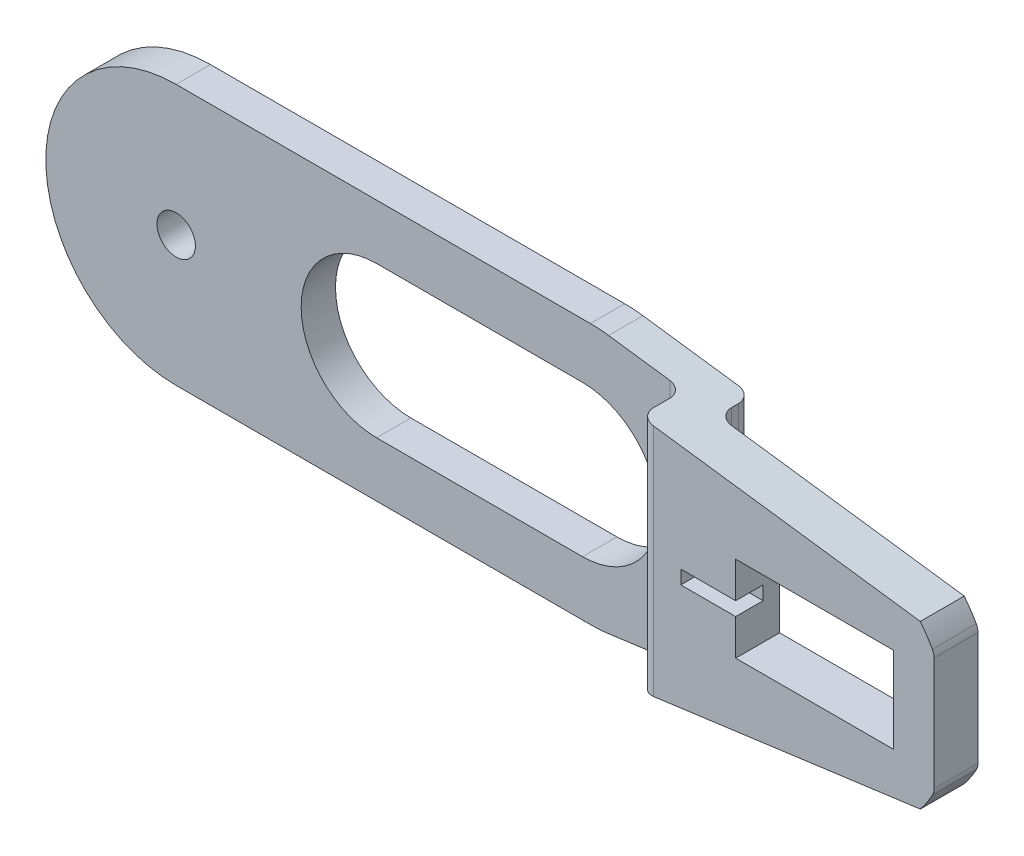
ISO-10303-21;
HEADER;
FILE_DESCRIPTION(('STEP AP214'),'2;1');
FILE_NAME('part.step','',(''),(''),'','','');
FILE_SCHEMA(('AUTOMOTIVE_DESIGN { 1 0 10303 214 1 1 1 1 }'));
ENDSEC;
DATA;
#1=APPLICATION_CONTEXT('core data for automotive mechanical design processes');
#2=APPLICATION_PROTOCOL_DEFINITION('international standard','automotive_design',2000,#1);
#3=PRODUCT_CONTEXT('',#1,'mechanical');
#4=PRODUCT('Part','Part','',(#3));
#5=PRODUCT_RELATED_PRODUCT_CATEGORY('part','',(#4));
#6=PRODUCT_DEFINITION_FORMATION('','',#4);
#7=PRODUCT_DEFINITION_CONTEXT('part definition',#1,'design');
#8=PRODUCT_DEFINITION('design','',#6,#7);
#9=PRODUCT_DEFINITION_SHAPE('','',#8);
#10=(LENGTH_UNIT() NAMED_UNIT(*) SI_UNIT(.MILLI.,.METRE.));
#11=(NAMED_UNIT(*) PLANE_ANGLE_UNIT() SI_UNIT($,.RADIAN.));
#12=(NAMED_UNIT(*) SI_UNIT($,.STERADIAN.) SOLID_ANGLE_UNIT());
#13=UNCERTAINTY_MEASURE_WITH_UNIT(LENGTH_MEASURE(1.E-05),#10,'distance_accuracy_value','');
#14=(GEOMETRIC_REPRESENTATION_CONTEXT(3) GLOBAL_UNCERTAINTY_ASSIGNED_CONTEXT((#13)) GLOBAL_UNIT_ASSIGNED_CONTEXT((#10,
#11,#12)) REPRESENTATION_CONTEXT('',''));
#15=CARTESIAN_POINT('',(0.,0.,0.));
#16=DIRECTION('',(0.,0.,1.));
#17=DIRECTION('',(1.,0.,0.));
#18=AXIS2_PLACEMENT_3D('',#15,#16,#17);
#19=CARTESIAN_POINT('',(114.863966496195,-8.25,5.));
#20=DIRECTION('',(0.,0.,-1.));
#21=DIRECTION('',(-1.,0.,0.));
#22=AXIS2_PLACEMENT_3D('',#19,#20,#21);
#23=CYLINDRICAL_SURFACE('',#22,2.);
#24=CARTESIAN_POINT('',(114.863966496195,-8.25,5.));
#25=DIRECTION('',(0.,0.,1.));
#26=DIRECTION('',(1.,0.,0.));
#27=AXIS2_PLACEMENT_3D('',#24,#25,#26);
#28=CIRCLE('',#27,2.);
#29=CARTESIAN_POINT('',(116.863966496195,-8.25,5.));
#30=VERTEX_POINT('',#29);
#31=CARTESIAN_POINT('',(116.612668436924,-9.22058823529413,5.));
#32=VERTEX_POINT('',#31);
#33=EDGE_CURVE('E285',#30,#32,#28,.F.);
#34=ORIENTED_EDGE('',*,*,#33,.F.);
#35=DIRECTION('',(0.,0.,1.));
#36=VECTOR('',#35,1.);
#37=CARTESIAN_POINT('',(116.863966496195,-8.25,-12.5303274767766));
#38=LINE('',#37,#36);
#39=CARTESIAN_POINT('',(116.863966496195,-8.25,11.4));
#40=VERTEX_POINT('',#39);
#41=EDGE_CURVE('E517',#30,#40,#38,.T.);
#42=ORIENTED_EDGE('',*,*,#41,.T.);
#43=CARTESIAN_POINT('',(114.863966496195,-8.25,11.4));
#44=DIRECTION('',(0.,0.,1.));
#45=DIRECTION('',(1.,0.,0.));
#46=AXIS2_PLACEMENT_3D('',#43,#44,#45);
#47=CIRCLE('',#46,2.);
#48=CARTESIAN_POINT('',(116.612668436924,-9.22058823529413,11.4));
#49=VERTEX_POINT('',#48);
#50=EDGE_CURVE('E405',#49,#40,#47,.T.);
#51=ORIENTED_EDGE('',*,*,#50,.F.);
#52=DIRECTION('',(0.,0.,-1.));
#53=VECTOR('',#52,1.);
#54=CARTESIAN_POINT('',(116.612668436924,-9.22058823529412,5.));
#55=LINE('',#54,#53);
#56=EDGE_CURVE('E271',#32,#49,#55,.F.);
#57=ORIENTED_EDGE('',*,*,#56,.F.);
#58=EDGE_LOOP('',(#34,#42,#51,#57));
#59=FACE_BOUND('',#58,.T.);
#60=ADVANCED_FACE('F36',(#59),#23,.T.);
#61=CARTESIAN_POINT('',(0.,0.,5.));
#62=DIRECTION('',(0.,0.,1.));
#63=DIRECTION('',(1.,0.,0.));
#64=AXIS2_PLACEMENT_3D('',#61,#62,#63);
#65=PLANE('',#64);
#66=DIRECTION('',(1.,0.,0.));
#67=VECTOR('',#66,1.);
#68=CARTESIAN_POINT('',(0.,-19.,5.));
#69=LINE('',#68,#67);
#70=CARTESIAN_POINT('',(0.,-19.,5.));
#71=VERTEX_POINT('',#70);
#72=CARTESIAN_POINT('',(60.3619810922793,-19.,5.));
#73=VERTEX_POINT('',#72);
#74=EDGE_CURVE('E334',#71,#73,#69,.T.);
#75=ORIENTED_EDGE('',*,*,#74,.T.);
#76=CARTESIAN_POINT('',(60.3619810922793,1.,5.));
#77=DIRECTION('',(0.,0.,1.));
#78=DIRECTION('',(1.,0.,0.));
#79=AXIS2_PLACEMENT_3D('',#76,#77,#78);
#80=CIRCLE('',#79,20.);
#81=CARTESIAN_POINT('',(63.0294810808894,-18.8213128679905,5.));
#82=VERTEX_POINT('',#81);
#83=EDGE_CURVE('E310',#73,#82,#80,.T.);
#84=ORIENTED_EDGE('',*,*,#83,.T.);
#85=DIRECTION('',(-0.991065643399524,-0.133374999430507,0.));
#86=VECTOR('',#85,1.);
#87=CARTESIAN_POINT('',(3.60908927937528,-26.8179524200414,5.));
#88=LINE('',#87,#86);
#89=CARTESIAN_POINT('',(71.9426168659981,-17.6218065707233,5.));
#90=VERTEX_POINT('',#89);
#91=EDGE_CURVE('E502',#90,#82,#88,.T.);
#92=ORIENTED_EDGE('',*,*,#91,.F.);
#93=DIRECTION('',(0.,-1.,0.));
#94=VECTOR('',#93,1.);
#95=CARTESIAN_POINT('',(71.9426168659981,0.,5.));
#96=LINE('',#95,#94);
#97=CARTESIAN_POINT('',(71.9426168659981,17.6218065707233,5.));
#98=VERTEX_POINT('',#97);
#99=EDGE_CURVE('E282',#90,#98,#96,.F.);
#100=ORIENTED_EDGE('',*,*,#99,.T.);
#101=DIRECTION('',(0.991065643399524,-0.133374999430507,0.));
#102=VECTOR('',#101,1.);
#103=CARTESIAN_POINT('',(3.60908927937528,26.8179524200414,5.));
#104=LINE('',#103,#102);
#105=CARTESIAN_POINT('',(63.0294810808894,18.8213128679905,5.));
#106=VERTEX_POINT('',#105);
#107=EDGE_CURVE('E466',#106,#98,#104,.T.);
#108=ORIENTED_EDGE('',*,*,#107,.F.);
#109=CARTESIAN_POINT('',(60.3619810922792,-1.,5.));
#110=DIRECTION('',(0.,0.,1.));
#111=DIRECTION('',(1.,0.,0.));
#112=AXIS2_PLACEMENT_3D('',#109,#110,#111);
#113=CIRCLE('',#112,20.);
#114=CARTESIAN_POINT('',(60.3619810922792,19.,5.));
#115=VERTEX_POINT('',#114);
#116=EDGE_CURVE('E308',#106,#115,#113,.T.);
#117=ORIENTED_EDGE('',*,*,#116,.T.);
#118=DIRECTION('',(-1.,0.,0.));
#119=VECTOR('',#118,1.);
#120=CARTESIAN_POINT('',(0.,19.,5.));
#121=LINE('',#120,#119);
#122=CARTESIAN_POINT('',(0.,19.,5.));
#123=VERTEX_POINT('',#122);
#124=EDGE_CURVE('E322',#115,#123,#121,.T.);
#125=ORIENTED_EDGE('',*,*,#124,.T.);
#126=CARTESIAN_POINT('',(0.,0.,5.));
#127=DIRECTION('',(0.,0.,1.));
#128=DIRECTION('',(1.,0.,0.));
#129=AXIS2_PLACEMENT_3D('',#126,#127,#128);
#130=CIRCLE('',#129,19.);
#131=EDGE_CURVE('E330',#123,#71,#130,.T.);
#132=ORIENTED_EDGE('',*,*,#131,.T.);
#133=EDGE_LOOP('',(#75,#84,#92,#100,#108,#117,#125,#132));
#134=FACE_BOUND('',#133,.T.);
#135=CARTESIAN_POINT('',(0.,0.,5.));
#136=DIRECTION('',(0.,0.,1.));
#137=DIRECTION('',(1.,0.,0.));
#138=AXIS2_PLACEMENT_3D('',#135,#136,#137);
#139=CIRCLE('',#138,2.8);
#140=CARTESIAN_POINT('',(2.8,0.,5.));
#141=VERTEX_POINT('',#140);
#142=EDGE_CURVE('E451',#141,#141,#139,.T.);
#143=ORIENTED_EDGE('',*,*,#142,.F.);
#144=EDGE_LOOP('',(#143));
#145=FACE_BOUND('',#144,.T.);
#146=DIRECTION('',(1.,0.,0.));
#147=VECTOR('',#146,1.);
#148=CARTESIAN_POINT('',(29.2177332505722,-11.,5.));
#149=LINE('',#148,#147);
#150=CARTESIAN_POINT('',(29.2177332505722,-11.,5.));
#151=VERTEX_POINT('',#150);
#152=CARTESIAN_POINT('',(59.2177332505723,-11.,5.));
#153=VERTEX_POINT('',#152);
#154=EDGE_CURVE('E422',#151,#153,#149,.T.);
#155=ORIENTED_EDGE('',*,*,#154,.F.);
#156=CARTESIAN_POINT('',(29.2177332505722,0.,5.));
#157=DIRECTION('',(0.,0.,1.));
#158=DIRECTION('',(1.,0.,0.));
#159=AXIS2_PLACEMENT_3D('',#156,#157,#158);
#160=CIRCLE('',#159,11.);
#161=CARTESIAN_POINT('',(29.2177332505722,11.,5.));
#162=VERTEX_POINT('',#161);
#163=EDGE_CURVE('E420',#162,#151,#160,.T.);
#164=ORIENTED_EDGE('',*,*,#163,.F.);
#165=DIRECTION('',(-1.,0.,0.));
#166=VECTOR('',#165,1.);
#167=CARTESIAN_POINT('',(29.2177332505722,11.,5.));
#168=LINE('',#167,#166);
#169=CARTESIAN_POINT('',(59.2177332505723,11.,5.));
#170=VERTEX_POINT('',#169);
#171=EDGE_CURVE('E428',#170,#162,#168,.T.);
#172=ORIENTED_EDGE('',*,*,#171,.F.);
#173=CARTESIAN_POINT('',(59.2177332505723,0.,5.));
#174=DIRECTION('',(0.,0.,1.));
#175=DIRECTION('',(1.,0.,0.));
#176=AXIS2_PLACEMENT_3D('',#173,#174,#175);
#177=CIRCLE('',#176,11.);
#178=EDGE_CURVE('E425',#153,#170,#177,.T.);
#179=ORIENTED_EDGE('',*,*,#178,.F.);
#180=EDGE_LOOP('',(#155,#164,#172,#179));
#181=FACE_BOUND('',#180,.T.);
#182=ADVANCED_FACE('F463',(#134,#145,#181),#65,.T.);
#183=CARTESIAN_POINT('',(0.,0.,0.));
#184=DIRECTION('',(0.,0.,1.));
#185=DIRECTION('',(1.,0.,0.));
#186=AXIS2_PLACEMENT_3D('',#183,#184,#185);
#187=PLANE('',#186);
#188=CARTESIAN_POINT('',(0.,0.,0.));
#189=DIRECTION('',(0.,0.,1.));
#190=DIRECTION('',(1.,0.,0.));
#191=AXIS2_PLACEMENT_3D('',#188,#189,#190);
#192=CIRCLE('',#191,2.8);
#193=CARTESIAN_POINT('',(2.8,0.,0.));
#194=VERTEX_POINT('',#193);
#195=EDGE_CURVE('E450',#194,#194,#192,.T.);
#196=ORIENTED_EDGE('',*,*,#195,.T.);
#197=EDGE_LOOP('',(#196));
#198=FACE_BOUND('',#197,.T.);
#199=DIRECTION('',(-0.991065643399524,-0.133374999430507,0.));
#200=VECTOR('',#199,1.);
#201=CARTESIAN_POINT('',(3.60908927937528,-26.8179524200414,0.));
#202=LINE('',#201,#200);
#203=CARTESIAN_POINT('',(76.9426168659981,-16.9489197628777,0.));
#204=VERTEX_POINT('',#203);
#205=CARTESIAN_POINT('',(63.0294810808894,-18.8213128679905,0.));
#206=VERTEX_POINT('',#205);
#207=EDGE_CURVE('E491',#204,#206,#202,.T.);
#208=ORIENTED_EDGE('',*,*,#207,.T.);
#209=CARTESIAN_POINT('',(60.3619810922793,1.,0.));
#210=DIRECTION('',(0.,0.,1.));
#211=DIRECTION('',(1.,0.,0.));
#212=AXIS2_PLACEMENT_3D('',#209,#210,#211);
#213=CIRCLE('',#212,20.);
#214=CARTESIAN_POINT('',(60.3619810922793,-19.,0.));
#215=VERTEX_POINT('',#214);
#216=EDGE_CURVE('E315',#206,#215,#213,.F.);
#217=ORIENTED_EDGE('',*,*,#216,.T.);
#218=DIRECTION('',(1.,0.,0.));
#219=VECTOR('',#218,1.);
#220=CARTESIAN_POINT('',(0.,-19.,0.));
#221=LINE('',#220,#219);
#222=CARTESIAN_POINT('',(0.,-19.,0.));
#223=VERTEX_POINT('',#222);
#224=EDGE_CURVE('E331',#223,#215,#221,.T.);
#225=ORIENTED_EDGE('',*,*,#224,.F.);
#226=CARTESIAN_POINT('',(0.,0.,0.));
#227=DIRECTION('',(0.,0.,1.));
#228=DIRECTION('',(1.,0.,0.));
#229=AXIS2_PLACEMENT_3D('',#226,#227,#228);
#230=CIRCLE('',#229,19.);
#231=CARTESIAN_POINT('',(0.,19.,0.));
#232=VERTEX_POINT('',#231);
#233=EDGE_CURVE('E329',#232,#223,#230,.T.);
#234=ORIENTED_EDGE('',*,*,#233,.F.);
#235=DIRECTION('',(-1.,0.,0.));
#236=VECTOR('',#235,1.);
#237=CARTESIAN_POINT('',(0.,19.,0.));
#238=LINE('',#237,#236);
#239=CARTESIAN_POINT('',(60.3619810922792,19.,0.));
#240=VERTEX_POINT('',#239);
#241=EDGE_CURVE('E320',#240,#232,#238,.T.);
#242=ORIENTED_EDGE('',*,*,#241,.F.);
#243=CARTESIAN_POINT('',(60.3619810922792,-1.,0.));
#244=DIRECTION('',(0.,0.,1.));
#245=DIRECTION('',(1.,0.,0.));
#246=AXIS2_PLACEMENT_3D('',#243,#244,#245);
#247=CIRCLE('',#246,20.);
#248=CARTESIAN_POINT('',(63.0294810808894,18.8213128679905,0.));
#249=VERTEX_POINT('',#248);
#250=EDGE_CURVE('E51',#240,#249,#247,.F.);
#251=ORIENTED_EDGE('',*,*,#250,.T.);
#252=DIRECTION('',(0.991065643399524,-0.133374999430507,0.));
#253=VECTOR('',#252,1.);
#254=CARTESIAN_POINT('',(3.60908927937528,26.8179524200414,0.));
#255=LINE('',#254,#253);
#256=CARTESIAN_POINT('',(76.9426168659981,16.9489197628777,0.));
#257=VERTEX_POINT('',#256);
#258=EDGE_CURVE('E468',#249,#257,#255,.T.);
#259=ORIENTED_EDGE('',*,*,#258,.T.);
#260=DIRECTION('',(0.,1.,0.));
#261=VECTOR('',#260,1.);
#262=CARTESIAN_POINT('',(76.9426168659981,0.,0.));
#263=LINE('',#262,#261);
#264=EDGE_CURVE('E297',#257,#204,#263,.F.);
#265=ORIENTED_EDGE('',*,*,#264,.T.);
#266=EDGE_LOOP('',(#208,#217,#225,#234,#242,#251,#259,#265));
#267=FACE_BOUND('',#266,.T.);
#268=CARTESIAN_POINT('',(29.2177332505722,0.,0.));
#269=DIRECTION('',(0.,0.,1.));
#270=DIRECTION('',(1.,0.,0.));
#271=AXIS2_PLACEMENT_3D('',#268,#269,#270);
#272=CIRCLE('',#271,11.);
#273=CARTESIAN_POINT('',(29.2177332505722,11.,0.));
#274=VERTEX_POINT('',#273);
#275=CARTESIAN_POINT('',(29.2177332505722,-11.,0.));
#276=VERTEX_POINT('',#275);
#277=EDGE_CURVE('E419',#274,#276,#272,.T.);
#278=ORIENTED_EDGE('',*,*,#277,.T.);
#279=DIRECTION('',(1.,0.,0.));
#280=VECTOR('',#279,1.);
#281=CARTESIAN_POINT('',(29.2177332505722,-11.,0.));
#282=LINE('',#281,#280);
#283=CARTESIAN_POINT('',(59.2177332505723,-11.,0.));
#284=VERTEX_POINT('',#283);
#285=EDGE_CURVE('E433',#276,#284,#282,.T.);
#286=ORIENTED_EDGE('',*,*,#285,.T.);
#287=CARTESIAN_POINT('',(59.2177332505723,0.,0.));
#288=DIRECTION('',(0.,0.,1.));
#289=DIRECTION('',(1.,0.,0.));
#290=AXIS2_PLACEMENT_3D('',#287,#288,#289);
#291=CIRCLE('',#290,11.);
#292=CARTESIAN_POINT('',(59.2177332505723,11.,0.));
#293=VERTEX_POINT('',#292);
#294=EDGE_CURVE('E436',#284,#293,#291,.T.);
#295=ORIENTED_EDGE('',*,*,#294,.T.);
#296=DIRECTION('',(-1.,0.,0.));
#297=VECTOR('',#296,1.);
#298=CARTESIAN_POINT('',(29.2177332505722,11.,0.));
#299=LINE('',#298,#297);
#300=EDGE_CURVE('E423',#293,#274,#299,.T.);
#301=ORIENTED_EDGE('',*,*,#300,.T.);
#302=EDGE_LOOP('',(#278,#286,#295,#301));
#303=FACE_BOUND('',#302,.T.);
#304=ADVANCED_FACE('F326',(#198,#267,#303),#187,.F.);
#305=CARTESIAN_POINT('',(0.,0.,5.));
#306=DIRECTION('',(0.,0.,-1.));
#307=DIRECTION('',(-1.,0.,0.));
#308=AXIS2_PLACEMENT_3D('',#305,#306,#307);
#309=CYLINDRICAL_SURFACE('',#308,19.);
#310=ORIENTED_EDGE('',*,*,#233,.T.);
#311=DIRECTION('',(0.,0.,-1.));
#312=VECTOR('',#311,1.);
#313=CARTESIAN_POINT('',(0.,-19.,5.));
#314=LINE('',#313,#312);
#315=EDGE_CURVE('E348',#71,#223,#314,.T.);
#316=ORIENTED_EDGE('',*,*,#315,.F.);
#317=ORIENTED_EDGE('',*,*,#131,.F.);
#318=DIRECTION('',(0.,0.,-1.));
#319=VECTOR('',#318,1.);
#320=CARTESIAN_POINT('',(0.,19.,5.));
#321=LINE('',#320,#319);
#322=EDGE_CURVE('E340',#123,#232,#321,.T.);
#323=ORIENTED_EDGE('',*,*,#322,.T.);
#324=EDGE_LOOP('',(#310,#316,#317,#323));
#325=FACE_BOUND('',#324,.T.);
#326=ADVANCED_FACE('F460',(#325),#309,.T.);
#327=CARTESIAN_POINT('',(0.,-19.,5.));
#328=DIRECTION('',(0.,1.,0.));
#329=DIRECTION('',(0.,0.,1.));
#330=AXIS2_PLACEMENT_3D('',#327,#328,#329);
#331=PLANE('',#330);
#332=ORIENTED_EDGE('',*,*,#224,.T.);
#333=DIRECTION('',(0.,0.,1.));
#334=VECTOR('',#333,1.);
#335=CARTESIAN_POINT('',(60.3619810922793,-19.,5.));
#336=LINE('',#335,#334);
#337=EDGE_CURVE('E305',#215,#73,#336,.T.);
#338=ORIENTED_EDGE('',*,*,#337,.T.);
#339=ORIENTED_EDGE('',*,*,#74,.F.);
#340=ORIENTED_EDGE('',*,*,#315,.T.);
#341=EDGE_LOOP('',(#332,#338,#339,#340));
#342=FACE_BOUND('',#341,.T.);
#343=ADVANCED_FACE('F617',(#342),#331,.F.);
#344=CARTESIAN_POINT('',(100.,0.,5.));
#345=DIRECTION('',(0.,0.,-1.));
#346=DIRECTION('',(-1.,0.,0.));
#347=AXIS2_PLACEMENT_3D('',#344,#345,#346);
#348=CYLINDRICAL_SURFACE('',#347,19.);
#349=CARTESIAN_POINT('',(100.,0.,11.4));
#350=DIRECTION('',(0.,0.,1.));
#351=DIRECTION('',(1.,0.,0.));
#352=AXIS2_PLACEMENT_3D('',#349,#350,#351);
#353=CIRCLE('',#352,19.);
#354=CARTESIAN_POINT('',(114.854358444509,-11.8468576087515,11.4));
#355=VERTEX_POINT('',#354);
#356=EDGE_CURVE('E398',#355,#49,#353,.T.);
#357=ORIENTED_EDGE('',*,*,#356,.F.);
#358=DIRECTION('',(0.,0.,-1.));
#359=VECTOR('',#358,1.);
#360=CARTESIAN_POINT('',(114.854358444509,-11.8468576087515,5.));
#361=LINE('',#360,#359);
#362=CARTESIAN_POINT('',(114.854358444509,-11.8468576087515,5.));
#363=VERTEX_POINT('',#362);
#364=EDGE_CURVE('E499',#355,#363,#361,.T.);
#365=ORIENTED_EDGE('',*,*,#364,.T.);
#366=CARTESIAN_POINT('',(100.,0.,5.));
#367=DIRECTION('',(0.,0.,1.));
#368=DIRECTION('',(1.,0.,0.));
#369=AXIS2_PLACEMENT_3D('',#366,#367,#368);
#370=CIRCLE('',#369,19.);
#371=EDGE_CURVE('E532',#363,#32,#370,.T.);
#372=ORIENTED_EDGE('',*,*,#371,.T.);
#373=ORIENTED_EDGE('',*,*,#56,.T.);
#374=EDGE_LOOP('',(#357,#365,#372,#373));
#375=FACE_BOUND('',#374,.T.);
#376=ADVANCED_FACE('F566',(#375),#348,.T.);
#377=CARTESIAN_POINT('',(87.9426168659981,-6.25,5.));
#378=DIRECTION('',(0.,-1.,0.));
#379=DIRECTION('',(0.,0.,-1.));
#380=AXIS2_PLACEMENT_3D('',#377,#378,#379);
#381=PLANE('',#380);
#382=DIRECTION('',(-1.,0.,0.));
#383=VECTOR('',#382,1.);
#384=CARTESIAN_POINT('',(114.863966496195,-6.25,11.4));
#385=LINE('',#384,#383);
#386=CARTESIAN_POINT('',(110.942616865998,-6.25,11.4));
#387=VERTEX_POINT('',#386);
#388=CARTESIAN_POINT('',(87.9426168659981,-6.25,11.4));
#389=VERTEX_POINT('',#388);
#390=EDGE_CURVE('E408',#387,#389,#385,.T.);
#391=ORIENTED_EDGE('',*,*,#390,.F.);
#392=DIRECTION('',(0.,0.,1.));
#393=VECTOR('',#392,1.);
#394=CARTESIAN_POINT('',(110.942616865998,-6.25,-12.5303274767766));
#395=LINE('',#394,#393);
#396=CARTESIAN_POINT('',(110.942616865998,-6.25,5.));
#397=VERTEX_POINT('',#396);
#398=EDGE_CURVE('E526',#397,#387,#395,.T.);
#399=ORIENTED_EDGE('',*,*,#398,.F.);
#400=DIRECTION('',(-1.,0.,0.));
#401=VECTOR('',#400,1.);
#402=CARTESIAN_POINT('',(87.9426168659981,-6.25,5.));
#403=LINE('',#402,#401);
#404=CARTESIAN_POINT('',(87.9426168659981,-6.25,5.));
#405=VERTEX_POINT('',#404);
#406=EDGE_CURVE('E519',#397,#405,#403,.T.);
#407=ORIENTED_EDGE('',*,*,#406,.T.);
#408=DIRECTION('',(0.,0.,-1.));
#409=VECTOR('',#408,1.);
#410=CARTESIAN_POINT('',(87.9426168659981,-6.25,5.));
#411=LINE('',#410,#409);
#412=EDGE_CURVE('E345',#389,#405,#411,.T.);
#413=ORIENTED_EDGE('',*,*,#412,.F.);
#414=EDGE_LOOP('',(#391,#399,#407,#413));
#415=FACE_BOUND('',#414,.T.);
#416=ADVANCED_FACE('F554',(#415),#381,.F.);
#417=CARTESIAN_POINT('',(87.9426168659981,-6.25,5.));
#418=DIRECTION('',(-1.,0.,0.));
#419=DIRECTION('',(0.,0.,1.));
#420=AXIS2_PLACEMENT_3D('',#417,#418,#419);
#421=PLANE('',#420);
#422=ORIENTED_EDGE('',*,*,#412,.T.);
#423=DIRECTION('',(0.,1.,0.));
#424=VECTOR('',#423,1.);
#425=CARTESIAN_POINT('',(87.9426168659981,-6.25,5.));
#426=LINE('',#425,#424);
#427=CARTESIAN_POINT('',(87.9426168659981,6.25,5.));
#428=VERTEX_POINT('',#427);
#429=EDGE_CURVE('E371',#405,#428,#426,.T.);
#430=ORIENTED_EDGE('',*,*,#429,.T.);
#431=DIRECTION('',(0.,0.,-1.));
#432=VECTOR('',#431,1.);
#433=CARTESIAN_POINT('',(87.9426168659981,6.25,5.));
#434=LINE('',#433,#432);
#435=CARTESIAN_POINT('',(87.9426168659981,6.25,11.4));
#436=VERTEX_POINT('',#435);
#437=EDGE_CURVE('E342',#436,#428,#434,.T.);
#438=ORIENTED_EDGE('',*,*,#437,.F.);
#439=DIRECTION('',(0.,1.,0.));
#440=VECTOR('',#439,1.);
#441=CARTESIAN_POINT('',(87.9426168659981,-6.25,11.4));
#442=LINE('',#441,#440);
#443=CARTESIAN_POINT('',(87.9426168659981,0.999999999999999,11.4));
#444=VERTEX_POINT('',#443);
#445=EDGE_CURVE('E410',#444,#436,#442,.T.);
#446=ORIENTED_EDGE('',*,*,#445,.F.);
#447=DIRECTION('',(0.,0.,1.));
#448=VECTOR('',#447,1.);
#449=CARTESIAN_POINT('',(87.9426168659981,0.999999999999999,7.4));
#450=LINE('',#449,#448);
#451=CARTESIAN_POINT('',(87.9426168659981,0.999999999999999,7.4));
#452=VERTEX_POINT('',#451);
#453=EDGE_CURVE('E388',#452,#444,#450,.T.);
#454=ORIENTED_EDGE('',*,*,#453,.F.);
#455=DIRECTION('',(0.,1.,0.));
#456=VECTOR('',#455,1.);
#457=CARTESIAN_POINT('',(87.9426168659981,0.999999999999999,7.4));
#458=LINE('',#457,#456);
#459=CARTESIAN_POINT('',(87.9426168659981,-1.,7.4));
#460=VERTEX_POINT('',#459);
#461=EDGE_CURVE('E375',#460,#452,#458,.T.);
#462=ORIENTED_EDGE('',*,*,#461,.F.);
#463=DIRECTION('',(0.,0.,1.));
#464=VECTOR('',#463,1.);
#465=CARTESIAN_POINT('',(87.9426168659981,-1.,7.4));
#466=LINE('',#465,#464);
#467=CARTESIAN_POINT('',(87.9426168659981,-1.,11.4));
#468=VERTEX_POINT('',#467);
#469=EDGE_CURVE('E395',#460,#468,#466,.T.);
#470=ORIENTED_EDGE('',*,*,#469,.T.);
#471=EDGE_CURVE('E411',#389,#468,#442,.T.);
#472=ORIENTED_EDGE('',*,*,#471,.F.);
#473=EDGE_LOOP('',(#422,#430,#438,#446,#454,#462,#470,#472));
#474=FACE_BOUND('',#473,.T.);
#475=ADVANCED_FACE('F537',(#474),#421,.F.);
#476=CARTESIAN_POINT('',(87.9426168659981,6.25,5.));
#477=DIRECTION('',(0.,1.,0.));
#478=DIRECTION('',(0.,0.,1.));
#479=AXIS2_PLACEMENT_3D('',#476,#477,#478);
#480=PLANE('',#479);
#481=DIRECTION('',(1.,0.,0.));
#482=VECTOR('',#481,1.);
#483=CARTESIAN_POINT('',(87.9426168659981,6.25,5.));
#484=LINE('',#483,#482);
#485=CARTESIAN_POINT('',(110.942616865998,6.25,5.));
#486=VERTEX_POINT('',#485);
#487=EDGE_CURVE('E367',#428,#486,#484,.T.);
#488=ORIENTED_EDGE('',*,*,#487,.T.);
#489=DIRECTION('',(0.,0.,1.));
#490=VECTOR('',#489,1.);
#491=CARTESIAN_POINT('',(110.942616865998,6.25,-12.5303274767766));
#492=LINE('',#491,#490);
#493=CARTESIAN_POINT('',(110.942616865998,6.25,11.4));
#494=VERTEX_POINT('',#493);
#495=EDGE_CURVE('E528',#486,#494,#492,.T.);
#496=ORIENTED_EDGE('',*,*,#495,.T.);
#497=DIRECTION('',(1.,0.,0.));
#498=VECTOR('',#497,1.);
#499=CARTESIAN_POINT('',(87.9426168659981,6.25,11.4));
#500=LINE('',#499,#498);
#501=EDGE_CURVE('E414',#436,#494,#500,.T.);
#502=ORIENTED_EDGE('',*,*,#501,.F.);
#503=ORIENTED_EDGE('',*,*,#437,.T.);
#504=EDGE_LOOP('',(#488,#496,#502,#503));
#505=FACE_BOUND('',#504,.T.);
#506=ADVANCED_FACE('F545',(#505),#480,.F.);
#507=CARTESIAN_POINT('',(100.,0.,5.));
#508=DIRECTION('',(0.,0.,-1.));
#509=DIRECTION('',(-1.,0.,0.));
#510=AXIS2_PLACEMENT_3D('',#507,#508,#509);
#511=CYLINDRICAL_SURFACE('',#510,19.);
#512=CARTESIAN_POINT('',(100.,0.,5.));
#513=DIRECTION('',(0.,0.,1.));
#514=DIRECTION('',(1.,0.,0.));
#515=AXIS2_PLACEMENT_3D('',#512,#513,#514);
#516=CIRCLE('',#515,19.);
#517=CARTESIAN_POINT('',(116.612668436924,9.22058823529412,5.));
#518=VERTEX_POINT('',#517);
#519=CARTESIAN_POINT('',(114.854358444509,11.8468576087515,5.));
#520=VERTEX_POINT('',#519);
#521=EDGE_CURVE('E355',#518,#520,#516,.T.);
#522=ORIENTED_EDGE('',*,*,#521,.T.);
#523=DIRECTION('',(0.,0.,-1.));
#524=VECTOR('',#523,1.);
#525=CARTESIAN_POINT('',(114.854358444509,11.8468576087515,5.));
#526=LINE('',#525,#524);
#527=CARTESIAN_POINT('',(114.854358444509,11.8468576087515,11.4));
#528=VERTEX_POINT('',#527);
#529=EDGE_CURVE('E483',#520,#528,#526,.F.);
#530=ORIENTED_EDGE('',*,*,#529,.T.);
#531=CARTESIAN_POINT('',(100.,0.,11.4));
#532=DIRECTION('',(0.,0.,1.));
#533=DIRECTION('',(1.,0.,0.));
#534=AXIS2_PLACEMENT_3D('',#531,#532,#533);
#535=CIRCLE('',#534,19.);
#536=CARTESIAN_POINT('',(116.612668436924,9.22058823529412,11.4));
#537=VERTEX_POINT('',#536);
#538=EDGE_CURVE('E264',#537,#528,#535,.T.);
#539=ORIENTED_EDGE('',*,*,#538,.F.);
#540=DIRECTION('',(0.,0.,-1.));
#541=VECTOR('',#540,1.);
#542=CARTESIAN_POINT('',(116.612668436924,9.22058823529412,5.));
#543=LINE('',#542,#541);
#544=EDGE_CURVE('E277',#537,#518,#543,.T.);
#545=ORIENTED_EDGE('',*,*,#544,.T.);
#546=EDGE_LOOP('',(#522,#530,#539,#545));
#547=FACE_BOUND('',#546,.T.);
#548=ADVANCED_FACE('F354',(#547),#511,.T.);
#549=CARTESIAN_POINT('',(0.,19.,5.));
#550=DIRECTION('',(0.,-1.,0.));
#551=DIRECTION('',(0.,0.,-1.));
#552=AXIS2_PLACEMENT_3D('',#549,#550,#551);
#553=PLANE('',#552);
#554=ORIENTED_EDGE('',*,*,#124,.F.);
#555=DIRECTION('',(0.,0.,-1.));
#556=VECTOR('',#555,1.);
#557=CARTESIAN_POINT('',(60.3619810922792,19.,5.));
#558=LINE('',#557,#556);
#559=EDGE_CURVE('E44',#115,#240,#558,.T.);
#560=ORIENTED_EDGE('',*,*,#559,.T.);
#561=ORIENTED_EDGE('',*,*,#241,.T.);
#562=ORIENTED_EDGE('',*,*,#322,.F.);
#563=EDGE_LOOP('',(#554,#560,#561,#562));
#564=FACE_BOUND('',#563,.T.);
#565=ADVANCED_FACE('F318',(#564),#553,.F.);
#566=CARTESIAN_POINT('',(0.,0.,5.));
#567=DIRECTION('',(0.,0.,-1.));
#568=DIRECTION('',(-1.,0.,0.));
#569=AXIS2_PLACEMENT_3D('',#566,#567,#568);
#570=CYLINDRICAL_SURFACE('',#569,2.8);
#571=ORIENTED_EDGE('',*,*,#142,.T.);
#572=EDGE_LOOP('',(#571));
#573=FACE_BOUND('',#572,.T.);
#574=ORIENTED_EDGE('',*,*,#195,.F.);
#575=EDGE_LOOP('',(#574));
#576=FACE_BOUND('',#575,.T.);
#577=ADVANCED_FACE('F636',(#573,#576),#570,.F.);
#578=CARTESIAN_POINT('',(29.2177332505722,0.,5.));
#579=DIRECTION('',(0.,0.,-1.));
#580=DIRECTION('',(-1.,0.,0.));
#581=AXIS2_PLACEMENT_3D('',#578,#579,#580);
#582=CYLINDRICAL_SURFACE('',#581,11.);
#583=ORIENTED_EDGE('',*,*,#277,.F.);
#584=DIRECTION('',(0.,0.,-1.));
#585=VECTOR('',#584,1.);
#586=CARTESIAN_POINT('',(29.2177332505722,11.,5.));
#587=LINE('',#586,#585);
#588=EDGE_CURVE('E430',#162,#274,#587,.T.);
#589=ORIENTED_EDGE('',*,*,#588,.F.);
#590=ORIENTED_EDGE('',*,*,#163,.T.);
#591=DIRECTION('',(0.,0.,-1.));
#592=VECTOR('',#591,1.);
#593=CARTESIAN_POINT('',(29.2177332505722,-11.,5.));
#594=LINE('',#593,#592);
#595=EDGE_CURVE('E447',#151,#276,#594,.T.);
#596=ORIENTED_EDGE('',*,*,#595,.T.);
#597=EDGE_LOOP('',(#583,#589,#590,#596));
#598=FACE_BOUND('',#597,.T.);
#599=ADVANCED_FACE('F642',(#598),#582,.F.);
#600=CARTESIAN_POINT('',(29.2177332505722,-11.,5.));
#601=DIRECTION('',(0.,1.,0.));
#602=DIRECTION('',(0.,0.,1.));
#603=AXIS2_PLACEMENT_3D('',#600,#601,#602);
#604=PLANE('',#603);
#605=ORIENTED_EDGE('',*,*,#285,.F.);
#606=ORIENTED_EDGE('',*,*,#595,.F.);
#607=ORIENTED_EDGE('',*,*,#154,.T.);
#608=DIRECTION('',(0.,0.,-1.));
#609=VECTOR('',#608,1.);
#610=CARTESIAN_POINT('',(59.2177332505723,-11.,5.));
#611=LINE('',#610,#609);
#612=EDGE_CURVE('E445',#153,#284,#611,.T.);
#613=ORIENTED_EDGE('',*,*,#612,.T.);
#614=EDGE_LOOP('',(#605,#606,#607,#613));
#615=FACE_BOUND('',#614,.T.);
#616=ADVANCED_FACE('F646',(#615),#604,.T.);
#617=CARTESIAN_POINT('',(59.2177332505723,0.,5.));
#618=DIRECTION('',(0.,0.,-1.));
#619=DIRECTION('',(-1.,0.,0.));
#620=AXIS2_PLACEMENT_3D('',#617,#618,#619);
#621=CYLINDRICAL_SURFACE('',#620,11.);
#622=ORIENTED_EDGE('',*,*,#294,.F.);
#623=ORIENTED_EDGE('',*,*,#612,.F.);
#624=ORIENTED_EDGE('',*,*,#178,.T.);
#625=DIRECTION('',(0.,0.,-1.));
#626=VECTOR('',#625,1.);
#627=CARTESIAN_POINT('',(59.2177332505723,11.,5.));
#628=LINE('',#627,#626);
#629=EDGE_CURVE('E443',#170,#293,#628,.T.);
#630=ORIENTED_EDGE('',*,*,#629,.T.);
#631=EDGE_LOOP('',(#622,#623,#624,#630));
#632=FACE_BOUND('',#631,.T.);
#633=ADVANCED_FACE('F650',(#632),#621,.F.);
#634=CARTESIAN_POINT('',(29.2177332505722,11.,5.));
#635=DIRECTION('',(0.,-1.,0.));
#636=DIRECTION('',(0.,0.,-1.));
#637=AXIS2_PLACEMENT_3D('',#634,#635,#636);
#638=PLANE('',#637);
#639=ORIENTED_EDGE('',*,*,#300,.F.);
#640=ORIENTED_EDGE('',*,*,#629,.F.);
#641=ORIENTED_EDGE('',*,*,#171,.T.);
#642=ORIENTED_EDGE('',*,*,#588,.T.);
#643=EDGE_LOOP('',(#639,#640,#641,#642));
#644=FACE_BOUND('',#643,.T.);
#645=ADVANCED_FACE('F654',(#644),#638,.T.);
#646=CARTESIAN_POINT('',(114.863966496195,8.25,5.));
#647=DIRECTION('',(0.,0.,-1.));
#648=DIRECTION('',(-1.,0.,0.));
#649=AXIS2_PLACEMENT_3D('',#646,#647,#648);
#650=CYLINDRICAL_SURFACE('',#649,2.);
#651=DIRECTION('',(0.,0.,1.));
#652=VECTOR('',#651,1.);
#653=CARTESIAN_POINT('',(116.863966496195,8.25,-12.5303274767766));
#654=LINE('',#653,#652);
#655=CARTESIAN_POINT('',(116.863966496195,8.25,5.));
#656=VERTEX_POINT('',#655);
#657=CARTESIAN_POINT('',(116.863966496195,8.25,11.4));
#658=VERTEX_POINT('',#657);
#659=EDGE_CURVE('E363',#656,#658,#654,.T.);
#660=ORIENTED_EDGE('',*,*,#659,.F.);
#661=CARTESIAN_POINT('',(114.863966496195,8.25,5.));
#662=DIRECTION('',(0.,0.,1.));
#663=DIRECTION('',(1.,0.,0.));
#664=AXIS2_PLACEMENT_3D('',#661,#662,#663);
#665=CIRCLE('',#664,2.);
#666=EDGE_CURVE('E362',#518,#656,#665,.F.);
#667=ORIENTED_EDGE('',*,*,#666,.F.);
#668=ORIENTED_EDGE('',*,*,#544,.F.);
#669=CARTESIAN_POINT('',(114.863966496195,8.25,11.4));
#670=DIRECTION('',(0.,0.,1.));
#671=DIRECTION('',(1.,0.,0.));
#672=AXIS2_PLACEMENT_3D('',#669,#670,#671);
#673=CIRCLE('',#672,2.);
#674=EDGE_CURVE('E359',#658,#537,#673,.T.);
#675=ORIENTED_EDGE('',*,*,#674,.F.);
#676=EDGE_LOOP('',(#660,#667,#668,#675));
#677=FACE_BOUND('',#676,.T.);
#678=ADVANCED_FACE('F358',(#677),#650,.T.);
#679=CARTESIAN_POINT('',(73.9426168659981,19.,11.4));
#680=DIRECTION('',(1.,0.,0.));
#681=DIRECTION('',(0.,0.,-1.));
#682=AXIS2_PLACEMENT_3D('',#679,#680,#681);
#683=PLANE('',#682);
#684=DIRECTION('',(0.,-1.,0.));
#685=VECTOR('',#684,1.);
#686=CARTESIAN_POINT('',(73.9426168659981,19.,7.));
#687=LINE('',#686,#685);
#688=CARTESIAN_POINT('',(73.9426168659981,17.352651847585,7.));
#689=VERTEX_POINT('',#688);
#690=CARTESIAN_POINT('',(73.9426168659981,-17.352651847585,7.));
#691=VERTEX_POINT('',#690);
#692=EDGE_CURVE('E270',#689,#691,#687,.T.);
#693=ORIENTED_EDGE('',*,*,#692,.T.);
#694=DIRECTION('',(0.,0.,1.));
#695=VECTOR('',#694,1.);
#696=CARTESIAN_POINT('',(73.9426168659981,-17.352651847585,11.4));
#697=LINE('',#696,#695);
#698=CARTESIAN_POINT('',(73.9426168659981,-17.352651847585,9.4));
#699=VERTEX_POINT('',#698);
#700=EDGE_CURVE('E508',#691,#699,#697,.T.);
#701=ORIENTED_EDGE('',*,*,#700,.T.);
#702=DIRECTION('',(0.,-1.,0.));
#703=VECTOR('',#702,1.);
#704=CARTESIAN_POINT('',(73.9426168659981,19.,9.4));
#705=LINE('',#704,#703);
#706=CARTESIAN_POINT('',(73.9426168659981,17.352651847585,9.4));
#707=VERTEX_POINT('',#706);
#708=EDGE_CURVE('E274',#699,#707,#705,.F.);
#709=ORIENTED_EDGE('',*,*,#708,.T.);
#710=DIRECTION('',(0.,0.,-1.));
#711=VECTOR('',#710,1.);
#712=CARTESIAN_POINT('',(73.9426168659981,17.352651847585,11.4));
#713=LINE('',#712,#711);
#714=EDGE_CURVE('E249',#707,#689,#713,.T.);
#715=ORIENTED_EDGE('',*,*,#714,.T.);
#716=EDGE_LOOP('',(#693,#701,#709,#715));
#717=FACE_BOUND('',#716,.T.);
#718=ADVANCED_FACE('F659',(#717),#683,.F.);
#719=CARTESIAN_POINT('',(100.,0.,11.4));
#720=DIRECTION('',(0.,0.,1.));
#721=DIRECTION('',(1.,0.,0.));
#722=AXIS2_PLACEMENT_3D('',#719,#720,#721);
#723=PLANE('',#722);
#724=DIRECTION('',(-0.991065643399524,-0.133374999430507,0.));
#725=VECTOR('',#724,1.);
#726=CARTESIAN_POINT('',(202.884451103646,0.,11.4));
#727=LINE('',#726,#725);
#728=CARTESIAN_POINT('',(75.9426168659981,-17.0834971244468,11.4));
#729=VERTEX_POINT('',#728);
#730=EDGE_CURVE('E265',#355,#729,#727,.T.);
#731=ORIENTED_EDGE('',*,*,#730,.F.);
#732=ORIENTED_EDGE('',*,*,#356,.T.);
#733=ORIENTED_EDGE('',*,*,#50,.T.);
#734=DIRECTION('',(0.,-1.,0.));
#735=VECTOR('',#734,1.);
#736=CARTESIAN_POINT('',(116.863966496195,0.,11.4));
#737=LINE('',#736,#735);
#738=EDGE_CURVE('E512',#658,#40,#737,.T.);
#739=ORIENTED_EDGE('',*,*,#738,.F.);
#740=ORIENTED_EDGE('',*,*,#674,.T.);
#741=ORIENTED_EDGE('',*,*,#538,.T.);
#742=DIRECTION('',(0.991065643399524,-0.133374999430507,0.));
#743=VECTOR('',#742,1.);
#744=CARTESIAN_POINT('',(49.1664602241961,20.6869616382619,11.4));
#745=LINE('',#744,#743);
#746=CARTESIAN_POINT('',(75.9426168659981,17.0834971244468,11.4));
#747=VERTEX_POINT('',#746);
#748=EDGE_CURVE('E246',#747,#528,#745,.T.);
#749=ORIENTED_EDGE('',*,*,#748,.F.);
#750=DIRECTION('',(0.,-1.,0.));
#751=VECTOR('',#750,1.);
#752=CARTESIAN_POINT('',(75.9426168659981,-19.,11.4));
#753=LINE('',#752,#751);
#754=EDGE_CURVE('E262',#747,#729,#753,.T.);
#755=ORIENTED_EDGE('',*,*,#754,.T.);
#756=EDGE_LOOP('',(#731,#732,#733,#739,#740,#741,#749,#755));
#757=FACE_BOUND('',#756,.T.);
#758=DIRECTION('',(0.,-1.,0.));
#759=VECTOR('',#758,1.);
#760=CARTESIAN_POINT('',(110.942616865998,0.,11.4));
#761=LINE('',#760,#759);
#762=EDGE_CURVE('E521',#494,#387,#761,.T.);
#763=ORIENTED_EDGE('',*,*,#762,.T.);
#764=ORIENTED_EDGE('',*,*,#390,.T.);
#765=ORIENTED_EDGE('',*,*,#471,.T.);
#766=DIRECTION('',(1.,0.,0.));
#767=VECTOR('',#766,1.);
#768=CARTESIAN_POINT('',(87.9426168659981,-1.,11.4));
#769=LINE('',#768,#767);
#770=CARTESIAN_POINT('',(79.9426168659981,-1.,11.4));
#771=VERTEX_POINT('',#770);
#772=EDGE_CURVE('E379',#771,#468,#769,.T.);
#773=ORIENTED_EDGE('',*,*,#772,.F.);
#774=DIRECTION('',(0.,-1.,0.));
#775=VECTOR('',#774,1.);
#776=CARTESIAN_POINT('',(79.9426168659981,0.999999999999998,11.4));
#777=LINE('',#776,#775);
#778=CARTESIAN_POINT('',(79.9426168659981,0.999999999999998,11.4));
#779=VERTEX_POINT('',#778);
#780=EDGE_CURVE('E391',#779,#771,#777,.T.);
#781=ORIENTED_EDGE('',*,*,#780,.F.);
#782=DIRECTION('',(-1.,0.,0.));
#783=VECTOR('',#782,1.);
#784=CARTESIAN_POINT('',(87.9426168659981,0.999999999999999,11.4));
#785=LINE('',#784,#783);
#786=EDGE_CURVE('E369',#444,#779,#785,.T.);
#787=ORIENTED_EDGE('',*,*,#786,.F.);
#788=ORIENTED_EDGE('',*,*,#445,.T.);
#789=ORIENTED_EDGE('',*,*,#501,.T.);
#790=EDGE_LOOP('',(#763,#764,#765,#773,#781,#787,#788,#789));
#791=FACE_BOUND('',#790,.T.);
#792=ADVANCED_FACE('F260',(#757,#791),#723,.T.);
#793=CARTESIAN_POINT('',(75.9426168659981,0.,9.4));
#794=DIRECTION('',(0.,1.,0.));
#795=DIRECTION('',(0.,0.,1.));
#796=AXIS2_PLACEMENT_3D('',#793,#794,#795);
#797=CYLINDRICAL_SURFACE('',#796,2.);
#798=CARTESIAN_POINT('',(75.9426168659981,-17.0834971244468,9.4));
#799=DIRECTION('',(-0.133374999430507,0.991065643399524,0.));
#800=DIRECTION('',(0.991065643399524,0.133374999430507,0.));
#801=AXIS2_PLACEMENT_3D('',#798,#799,#800);
#802=ELLIPSE('',#801,2.01802979784433,2.);
#803=EDGE_CURVE('E269',#729,#699,#802,.F.);
#804=ORIENTED_EDGE('',*,*,#803,.F.);
#805=ORIENTED_EDGE('',*,*,#754,.F.);
#806=CARTESIAN_POINT('',(75.9426168659981,17.0834971244468,9.4));
#807=DIRECTION('',(-0.133374999430507,-0.991065643399524,0.));
#808=DIRECTION('',(-0.991065643399524,0.133374999430507,0.));
#809=AXIS2_PLACEMENT_3D('',#806,#807,#808);
#810=ELLIPSE('',#809,2.01802979784433,2.);
#811=EDGE_CURVE('E243',#707,#747,#810,.F.);
#812=ORIENTED_EDGE('',*,*,#811,.F.);
#813=ORIENTED_EDGE('',*,*,#708,.F.);
#814=EDGE_LOOP('',(#804,#805,#812,#813));
#815=FACE_BOUND('',#814,.T.);
#816=ADVANCED_FACE('F268',(#815),#797,.T.);
#817=CARTESIAN_POINT('',(71.9426168659981,19.,7.));
#818=DIRECTION('',(0.,-1.,0.));
#819=DIRECTION('',(0.,0.,-1.));
#820=AXIS2_PLACEMENT_3D('',#817,#818,#819);
#821=CYLINDRICAL_SURFACE('',#820,2.);
#822=ORIENTED_EDGE('',*,*,#99,.F.);
#823=CARTESIAN_POINT('',(71.9426168659981,-17.6218065707233,7.));
#824=DIRECTION('',(-0.133374999430507,0.991065643399524,0.));
#825=DIRECTION('',(-0.991065643399524,-0.133374999430507,0.));
#826=AXIS2_PLACEMENT_3D('',#823,#824,#825);
#827=ELLIPSE('',#826,2.01802979784433,2.);
#828=EDGE_CURVE('E505',#90,#691,#827,.F.);
#829=ORIENTED_EDGE('',*,*,#828,.T.);
#830=ORIENTED_EDGE('',*,*,#692,.F.);
#831=CARTESIAN_POINT('',(71.9426168659981,17.6218065707233,7.));
#832=DIRECTION('',(-0.133374999430507,-0.991065643399524,0.));
#833=DIRECTION('',(0.991065643399524,-0.133374999430507,0.));
#834=AXIS2_PLACEMENT_3D('',#831,#832,#833);
#835=ELLIPSE('',#834,2.01802979784433,2.);
#836=EDGE_CURVE('E486',#689,#98,#835,.F.);
#837=ORIENTED_EDGE('',*,*,#836,.T.);
#838=EDGE_LOOP('',(#822,#829,#830,#837));
#839=FACE_BOUND('',#838,.T.);
#840=ADVANCED_FACE('F594',(#839),#821,.F.);
#841=CARTESIAN_POINT('',(87.9426168659981,-1.,7.4));
#842=DIRECTION('',(0.,-1.,0.));
#843=DIRECTION('',(1.,0.,0.));
#844=AXIS2_PLACEMENT_3D('',#841,#842,#843);
#845=PLANE('',#844);
#846=ORIENTED_EDGE('',*,*,#772,.T.);
#847=ORIENTED_EDGE('',*,*,#469,.F.);
#848=DIRECTION('',(1.,0.,0.));
#849=VECTOR('',#848,1.);
#850=CARTESIAN_POINT('',(87.9426168659981,-1.,7.4));
#851=LINE('',#850,#849);
#852=CARTESIAN_POINT('',(79.9426168659981,-1.,7.4));
#853=VERTEX_POINT('',#852);
#854=EDGE_CURVE('E385',#853,#460,#851,.T.);
#855=ORIENTED_EDGE('',*,*,#854,.F.);
#856=DIRECTION('',(0.,0.,1.));
#857=VECTOR('',#856,1.);
#858=CARTESIAN_POINT('',(79.9426168659981,-1.,7.4));
#859=LINE('',#858,#857);
#860=EDGE_CURVE('E399',#853,#771,#859,.T.);
#861=ORIENTED_EDGE('',*,*,#860,.T.);
#862=EDGE_LOOP('',(#846,#847,#855,#861));
#863=FACE_BOUND('',#862,.T.);
#864=ADVANCED_FACE('F597',(#863),#845,.F.);
#865=CARTESIAN_POINT('',(79.9426168659981,0.999999999999998,7.4));
#866=DIRECTION('',(-1.,0.,0.));
#867=DIRECTION('',(0.,0.,1.));
#868=AXIS2_PLACEMENT_3D('',#865,#866,#867);
#869=PLANE('',#868);
#870=ORIENTED_EDGE('',*,*,#780,.T.);
#871=ORIENTED_EDGE('',*,*,#860,.F.);
#872=DIRECTION('',(0.,-1.,0.));
#873=VECTOR('',#872,1.);
#874=CARTESIAN_POINT('',(79.9426168659981,0.999999999999998,7.4));
#875=LINE('',#874,#873);
#876=CARTESIAN_POINT('',(79.9426168659981,0.999999999999998,7.4));
#877=VERTEX_POINT('',#876);
#878=EDGE_CURVE('E382',#877,#853,#875,.T.);
#879=ORIENTED_EDGE('',*,*,#878,.F.);
#880=DIRECTION('',(0.,0.,1.));
#881=VECTOR('',#880,1.);
#882=CARTESIAN_POINT('',(79.9426168659981,0.999999999999998,7.4));
#883=LINE('',#882,#881);
#884=EDGE_CURVE('E401',#877,#779,#883,.T.);
#885=ORIENTED_EDGE('',*,*,#884,.T.);
#886=EDGE_LOOP('',(#870,#871,#879,#885));
#887=FACE_BOUND('',#886,.T.);
#888=ADVANCED_FACE('F668',(#887),#869,.F.);
#889=CARTESIAN_POINT('',(87.9426168659981,0.999999999999999,7.4));
#890=DIRECTION('',(0.,1.,0.));
#891=DIRECTION('',(-1.,0.,0.));
#892=AXIS2_PLACEMENT_3D('',#889,#890,#891);
#893=PLANE('',#892);
#894=ORIENTED_EDGE('',*,*,#786,.T.);
#895=ORIENTED_EDGE('',*,*,#884,.F.);
#896=DIRECTION('',(-1.,0.,0.));
#897=VECTOR('',#896,1.);
#898=CARTESIAN_POINT('',(87.9426168659981,0.999999999999999,7.4));
#899=LINE('',#898,#897);
#900=EDGE_CURVE('E378',#452,#877,#899,.T.);
#901=ORIENTED_EDGE('',*,*,#900,.F.);
#902=ORIENTED_EDGE('',*,*,#453,.T.);
#903=EDGE_LOOP('',(#894,#895,#901,#902));
#904=FACE_BOUND('',#903,.T.);
#905=ADVANCED_FACE('F665',(#904),#893,.F.);
#906=CARTESIAN_POINT('',(0.,0.,7.4));
#907=DIRECTION('',(0.,0.,-1.));
#908=DIRECTION('',(-1.,0.,0.));
#909=AXIS2_PLACEMENT_3D('',#906,#907,#908);
#910=PLANE('',#909);
#911=ORIENTED_EDGE('',*,*,#461,.T.);
#912=ORIENTED_EDGE('',*,*,#900,.T.);
#913=ORIENTED_EDGE('',*,*,#878,.T.);
#914=ORIENTED_EDGE('',*,*,#854,.T.);
#915=EDGE_LOOP('',(#911,#912,#913,#914));
#916=FACE_BOUND('',#915,.T.);
#917=ADVANCED_FACE('F558',(#916),#910,.F.);
#918=CARTESIAN_POINT('',(0.,0.,5.));
#919=DIRECTION('',(0.,0.,1.));
#920=DIRECTION('',(1.,0.,0.));
#921=AXIS2_PLACEMENT_3D('',#918,#919,#920);
#922=PLANE('',#921);
#923=DIRECTION('',(0.,1.,0.));
#924=VECTOR('',#923,1.);
#925=CARTESIAN_POINT('',(110.942616865998,0.,5.));
#926=LINE('',#925,#924);
#927=EDGE_CURVE('E513',#397,#486,#926,.T.);
#928=ORIENTED_EDGE('',*,*,#927,.T.);
#929=ORIENTED_EDGE('',*,*,#487,.F.);
#930=ORIENTED_EDGE('',*,*,#429,.F.);
#931=ORIENTED_EDGE('',*,*,#406,.F.);
#932=EDGE_LOOP('',(#928,#929,#930,#931));
#933=FACE_BOUND('',#932,.T.);
#934=ORIENTED_EDGE('',*,*,#371,.F.);
#935=DIRECTION('',(-0.991065643399524,-0.133374999430507,0.));
#936=VECTOR('',#935,1.);
#937=CARTESIAN_POINT('',(3.60908927937528,-26.8179524200414,5.));
#938=LINE('',#937,#936);
#939=CARTESIAN_POINT('',(80.9426168659981,-16.4106103166012,5.));
#940=VERTEX_POINT('',#939);
#941=EDGE_CURVE('E496',#363,#940,#938,.T.);
#942=ORIENTED_EDGE('',*,*,#941,.T.);
#943=DIRECTION('',(0.,1.,0.));
#944=VECTOR('',#943,1.);
#945=CARTESIAN_POINT('',(80.9426168659981,19.,5.));
#946=LINE('',#945,#944);
#947=CARTESIAN_POINT('',(80.9426168659981,16.4106103166012,5.));
#948=VERTEX_POINT('',#947);
#949=EDGE_CURVE('E288',#940,#948,#946,.T.);
#950=ORIENTED_EDGE('',*,*,#949,.T.);
#951=DIRECTION('',(0.991065643399524,-0.133374999430507,0.));
#952=VECTOR('',#951,1.);
#953=CARTESIAN_POINT('',(3.60908927937528,26.8179524200414,5.));
#954=LINE('',#953,#952);
#955=EDGE_CURVE('E475',#948,#520,#954,.T.);
#956=ORIENTED_EDGE('',*,*,#955,.T.);
#957=ORIENTED_EDGE('',*,*,#521,.F.);
#958=ORIENTED_EDGE('',*,*,#666,.T.);
#959=DIRECTION('',(0.,1.,0.));
#960=VECTOR('',#959,1.);
#961=CARTESIAN_POINT('',(116.863966496195,0.,5.));
#962=LINE('',#961,#960);
#963=EDGE_CURVE('E516',#30,#656,#962,.T.);
#964=ORIENTED_EDGE('',*,*,#963,.F.);
#965=ORIENTED_EDGE('',*,*,#33,.T.);
#966=EDGE_LOOP('',(#934,#942,#950,#956,#957,#958,#964,#965));
#967=FACE_BOUND('',#966,.T.);
#968=ADVANCED_FACE('F555',(#933,#967),#922,.F.);
#969=CARTESIAN_POINT('',(78.9426168659981,-19.,5.));
#970=DIRECTION('',(-1.,0.,0.));
#971=DIRECTION('',(0.,0.,1.));
#972=AXIS2_PLACEMENT_3D('',#969,#970,#971);
#973=PLANE('',#972);
#974=DIRECTION('',(0.,1.,0.));
#975=VECTOR('',#974,1.);
#976=CARTESIAN_POINT('',(78.9426168659981,-19.,3.));
#977=LINE('',#976,#975);
#978=CARTESIAN_POINT('',(78.9426168659981,16.6797650397395,3.));
#979=VERTEX_POINT('',#978);
#980=CARTESIAN_POINT('',(78.9426168659981,-16.6797650397395,3.));
#981=VERTEX_POINT('',#980);
#982=EDGE_CURVE('E294',#979,#981,#977,.F.);
#983=ORIENTED_EDGE('',*,*,#982,.T.);
#984=DIRECTION('',(0.,0.,-1.));
#985=VECTOR('',#984,1.);
#986=CARTESIAN_POINT('',(78.9426168659981,-16.6797650397395,5.));
#987=LINE('',#986,#985);
#988=CARTESIAN_POINT('',(78.9426168659981,-16.6797650397395,2.));
#989=VERTEX_POINT('',#988);
#990=EDGE_CURVE('E254',#981,#989,#987,.T.);
#991=ORIENTED_EDGE('',*,*,#990,.T.);
#992=DIRECTION('',(0.,1.,0.));
#993=VECTOR('',#992,1.);
#994=CARTESIAN_POINT('',(78.9426168659981,-19.,2.));
#995=LINE('',#994,#993);
#996=CARTESIAN_POINT('',(78.9426168659981,16.6797650397395,2.));
#997=VERTEX_POINT('',#996);
#998=EDGE_CURVE('E291',#989,#997,#995,.T.);
#999=ORIENTED_EDGE('',*,*,#998,.T.);
#1000=DIRECTION('',(0.,0.,1.));
#1001=VECTOR('',#1000,1.);
#1002=CARTESIAN_POINT('',(78.9426168659981,16.6797650397395,5.));
#1003=LINE('',#1002,#1001);
#1004=EDGE_CURVE('E472',#997,#979,#1003,.T.);
#1005=ORIENTED_EDGE('',*,*,#1004,.T.);
#1006=EDGE_LOOP('',(#983,#991,#999,#1005));
#1007=FACE_BOUND('',#1006,.T.);
#1008=ADVANCED_FACE('F557',(#1007),#973,.F.);
#1009=CARTESIAN_POINT('',(80.9426168659981,0.,3.));
#1010=DIRECTION('',(0.,-1.,0.));
#1011=DIRECTION('',(0.,0.,-1.));
#1012=AXIS2_PLACEMENT_3D('',#1009,#1010,#1011);
#1013=CYLINDRICAL_SURFACE('',#1012,2.);
#1014=ORIENTED_EDGE('',*,*,#949,.F.);
#1015=CARTESIAN_POINT('',(80.9426168659981,-16.4106103166012,3.));
#1016=DIRECTION('',(-0.133374999430507,0.991065643399524,0.));
#1017=DIRECTION('',(-0.991065643399524,-0.133374999430507,0.));
#1018=AXIS2_PLACEMENT_3D('',#1015,#1016,#1017);
#1019=ELLIPSE('',#1018,2.01802979784433,2.);
#1020=EDGE_CURVE('E493',#940,#981,#1019,.F.);
#1021=ORIENTED_EDGE('',*,*,#1020,.T.);
#1022=ORIENTED_EDGE('',*,*,#982,.F.);
#1023=CARTESIAN_POINT('',(80.9426168659981,16.4106103166012,3.));
#1024=DIRECTION('',(-0.133374999430507,-0.991065643399524,0.));
#1025=DIRECTION('',(0.991065643399524,-0.133374999430507,0.));
#1026=AXIS2_PLACEMENT_3D('',#1023,#1024,#1025);
#1027=ELLIPSE('',#1026,2.01802979784433,2.);
#1028=EDGE_CURVE('E471',#979,#948,#1027,.F.);
#1029=ORIENTED_EDGE('',*,*,#1028,.T.);
#1030=EDGE_LOOP('',(#1014,#1021,#1022,#1029));
#1031=FACE_BOUND('',#1030,.T.);
#1032=ADVANCED_FACE('F599',(#1031),#1013,.F.);
#1033=CARTESIAN_POINT('',(76.9426168659981,-19.,2.));
#1034=DIRECTION('',(0.,1.,0.));
#1035=DIRECTION('',(0.,0.,1.));
#1036=AXIS2_PLACEMENT_3D('',#1033,#1034,#1035);
#1037=CYLINDRICAL_SURFACE('',#1036,2.);
#1038=CARTESIAN_POINT('',(76.9426168659981,-16.9489197628777,2.));
#1039=DIRECTION('',(-0.133374999430507,0.991065643399524,0.));
#1040=DIRECTION('',(0.991065643399524,0.133374999430507,0.));
#1041=AXIS2_PLACEMENT_3D('',#1038,#1039,#1040);
#1042=ELLIPSE('',#1041,2.01802979784433,2.);
#1043=EDGE_CURVE('E303',#204,#989,#1042,.F.);
#1044=ORIENTED_EDGE('',*,*,#1043,.F.);
#1045=ORIENTED_EDGE('',*,*,#264,.F.);
#1046=CARTESIAN_POINT('',(76.9426168659981,16.9489197628777,2.));
#1047=DIRECTION('',(-0.133374999430507,-0.991065643399524,0.));
#1048=DIRECTION('',(-0.991065643399524,0.133374999430507,0.));
#1049=AXIS2_PLACEMENT_3D('',#1046,#1047,#1048);
#1050=ELLIPSE('',#1049,2.01802979784433,2.);
#1051=EDGE_CURVE('E300',#997,#257,#1050,.F.);
#1052=ORIENTED_EDGE('',*,*,#1051,.F.);
#1053=ORIENTED_EDGE('',*,*,#998,.F.);
#1054=EDGE_LOOP('',(#1044,#1045,#1052,#1053));
#1055=FACE_BOUND('',#1054,.T.);
#1056=ADVANCED_FACE('F581',(#1055),#1037,.T.);
#1057=CARTESIAN_POINT('',(110.942616865998,0.,-12.5303274767766));
#1058=DIRECTION('',(-1.,0.,0.));
#1059=DIRECTION('',(0.,0.,1.));
#1060=AXIS2_PLACEMENT_3D('',#1057,#1058,#1059);
#1061=PLANE('',#1060);
#1062=ORIENTED_EDGE('',*,*,#927,.F.);
#1063=ORIENTED_EDGE('',*,*,#398,.T.);
#1064=ORIENTED_EDGE('',*,*,#762,.F.);
#1065=ORIENTED_EDGE('',*,*,#495,.F.);
#1066=EDGE_LOOP('',(#1062,#1063,#1064,#1065));
#1067=FACE_BOUND('',#1066,.T.);
#1068=ADVANCED_FACE('F551',(#1067),#1061,.T.);
#1069=CARTESIAN_POINT('',(116.863966496195,0.,-12.5303274767766));
#1070=DIRECTION('',(-1.,0.,0.));
#1071=DIRECTION('',(0.,0.,1.));
#1072=AXIS2_PLACEMENT_3D('',#1069,#1070,#1071);
#1073=PLANE('',#1072);
#1074=ORIENTED_EDGE('',*,*,#41,.F.);
#1075=ORIENTED_EDGE('',*,*,#963,.T.);
#1076=ORIENTED_EDGE('',*,*,#659,.T.);
#1077=ORIENTED_EDGE('',*,*,#738,.T.);
#1078=EDGE_LOOP('',(#1074,#1075,#1076,#1077));
#1079=FACE_BOUND('',#1078,.T.);
#1080=ADVANCED_FACE('F573',(#1079),#1073,.F.);
#1081=CARTESIAN_POINT('',(49.1664602241961,20.6869616382619,-40.6));
#1082=DIRECTION('',(-0.133374999430507,-0.991065643399524,0.));
#1083=DIRECTION('',(0.991065643399524,-0.133374999430507,0.));
#1084=AXIS2_PLACEMENT_3D('',#1081,#1082,#1083);
#1085=PLANE('',#1084);
#1086=ORIENTED_EDGE('',*,*,#258,.F.);
#1087=DIRECTION('',(0.,0.,-1.));
#1088=VECTOR('',#1087,1.);
#1089=CARTESIAN_POINT('',(63.0294810808894,18.8213128679905,-40.6));
#1090=LINE('',#1089,#1088);
#1091=EDGE_CURVE('E11',#249,#106,#1090,.F.);
#1092=ORIENTED_EDGE('',*,*,#1091,.T.);
#1093=ORIENTED_EDGE('',*,*,#107,.T.);
#1094=ORIENTED_EDGE('',*,*,#836,.F.);
#1095=ORIENTED_EDGE('',*,*,#714,.F.);
#1096=ORIENTED_EDGE('',*,*,#811,.T.);
#1097=ORIENTED_EDGE('',*,*,#748,.T.);
#1098=ORIENTED_EDGE('',*,*,#529,.F.);
#1099=ORIENTED_EDGE('',*,*,#955,.F.);
#1100=ORIENTED_EDGE('',*,*,#1028,.F.);
#1101=ORIENTED_EDGE('',*,*,#1004,.F.);
#1102=ORIENTED_EDGE('',*,*,#1051,.T.);
#1103=EDGE_LOOP('',(#1086,#1092,#1093,#1094,#1095,#1096,#1097,#1098,#1099,#1100,#1101,#1102));
#1104=FACE_BOUND('',#1103,.T.);
#1105=ADVANCED_FACE('F245',(#1104),#1085,.F.);
#1106=CARTESIAN_POINT('',(202.884451103646,0.,-40.6));
#1107=DIRECTION('',(-0.133374999430507,0.991065643399524,0.));
#1108=DIRECTION('',(-0.991065643399524,-0.133374999430507,0.));
#1109=AXIS2_PLACEMENT_3D('',#1106,#1107,#1108);
#1110=PLANE('',#1109);
#1111=ORIENTED_EDGE('',*,*,#91,.T.);
#1112=DIRECTION('',(0.,0.,1.));
#1113=VECTOR('',#1112,1.);
#1114=CARTESIAN_POINT('',(63.0294810808894,-18.8213128679905,-40.6));
#1115=LINE('',#1114,#1113);
#1116=EDGE_CURVE('E312',#82,#206,#1115,.F.);
#1117=ORIENTED_EDGE('',*,*,#1116,.T.);
#1118=ORIENTED_EDGE('',*,*,#207,.F.);
#1119=ORIENTED_EDGE('',*,*,#1043,.T.);
#1120=ORIENTED_EDGE('',*,*,#990,.F.);
#1121=ORIENTED_EDGE('',*,*,#1020,.F.);
#1122=ORIENTED_EDGE('',*,*,#941,.F.);
#1123=ORIENTED_EDGE('',*,*,#364,.F.);
#1124=ORIENTED_EDGE('',*,*,#730,.T.);
#1125=ORIENTED_EDGE('',*,*,#803,.T.);
#1126=ORIENTED_EDGE('',*,*,#700,.F.);
#1127=ORIENTED_EDGE('',*,*,#828,.F.);
#1128=EDGE_LOOP('',(#1111,#1117,#1118,#1119,#1120,#1121,#1122,#1123,#1124,#1125,#1126,#1127));
#1129=FACE_BOUND('',#1128,.T.);
#1130=ADVANCED_FACE('F569',(#1129),#1110,.F.);
#1131=CARTESIAN_POINT('',(60.3619810922793,1.,5.));
#1132=DIRECTION('',(0.,0.,1.));
#1133=DIRECTION('',(1.,0.,0.));
#1134=AXIS2_PLACEMENT_3D('',#1131,#1132,#1133);
#1135=CYLINDRICAL_SURFACE('',#1134,20.);
#1136=ORIENTED_EDGE('',*,*,#216,.F.);
#1137=ORIENTED_EDGE('',*,*,#1116,.F.);
#1138=ORIENTED_EDGE('',*,*,#83,.F.);
#1139=ORIENTED_EDGE('',*,*,#337,.F.);
#1140=EDGE_LOOP('',(#1136,#1137,#1138,#1139));
#1141=FACE_BOUND('',#1140,.T.);
#1142=ADVANCED_FACE('F605',(#1141),#1135,.T.);
#1143=CARTESIAN_POINT('',(60.3619810922792,-1.,5.));
#1144=DIRECTION('',(0.,0.,-1.));
#1145=DIRECTION('',(-1.,0.,0.));
#1146=AXIS2_PLACEMENT_3D('',#1143,#1144,#1145);
#1147=CYLINDRICAL_SURFACE('',#1146,20.);
#1148=ORIENTED_EDGE('',*,*,#116,.F.);
#1149=ORIENTED_EDGE('',*,*,#1091,.F.);
#1150=ORIENTED_EDGE('',*,*,#250,.F.);
#1151=ORIENTED_EDGE('',*,*,#559,.F.);
#1152=EDGE_LOOP('',(#1148,#1149,#1150,#1151));
#1153=FACE_BOUND('',#1152,.T.);
#1154=ADVANCED_FACE('F38',(#1153),#1147,.T.);
#1155=CLOSED_SHELL('',(#60,#182,#304,#326,#343,#376,#416,#475,#506,#548,#565,#577,#599,#616,
#633,#645,#678,#718,#792,#816,#840,#864,#888,#905,#917,#968,#1008,#1032,#1056,#1068,#1080,#1105,
#1130,#1142,#1154));
#1156=MANIFOLD_SOLID_BREP('B2',#1155);
#1157=ADVANCED_BREP_SHAPE_REPRESENTATION('',(#18,#1156),#14);
#1158=SHAPE_DEFINITION_REPRESENTATION(#9,#1157);
ENDSEC;
END-ISO-10303-21;
